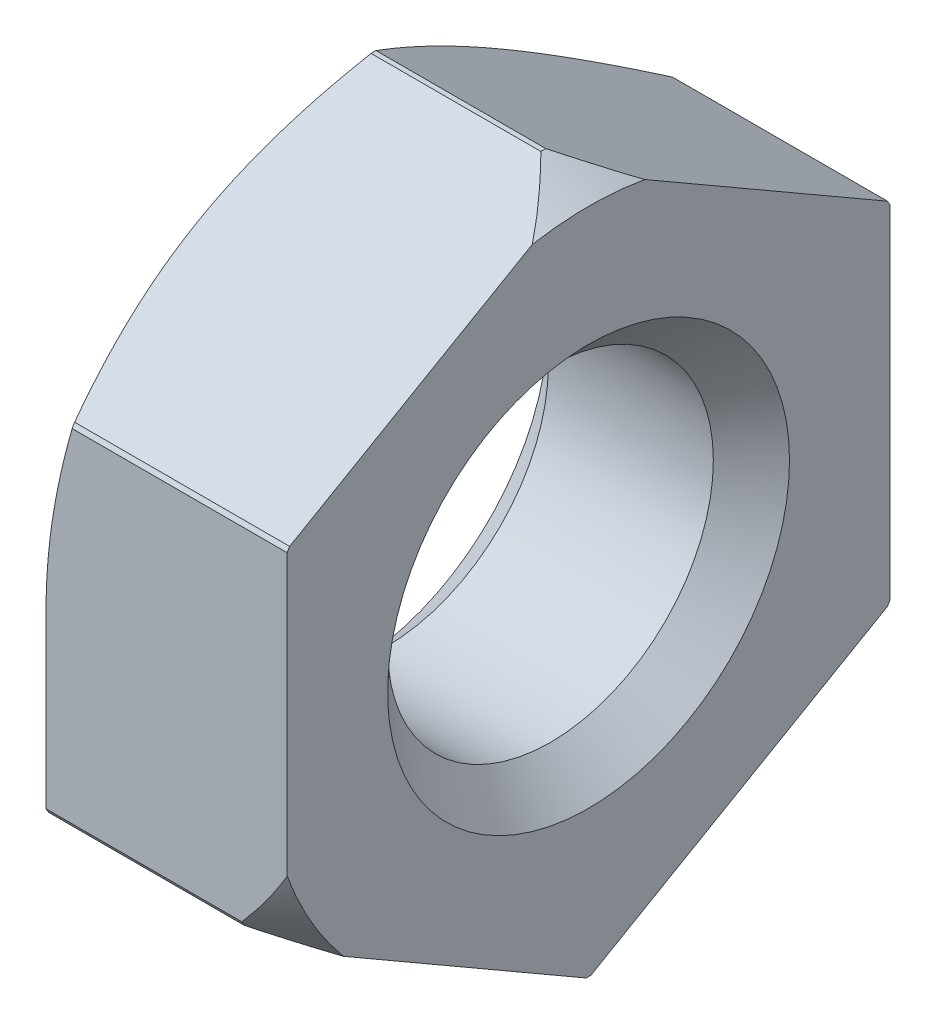
ISO-10303-21;
HEADER;
FILE_DESCRIPTION(('STEP AP214'),'2;1');
FILE_NAME('part.step','',(''),(''),'','','');
FILE_SCHEMA(('AUTOMOTIVE_DESIGN { 1 0 10303 214 1 1 1 1 }'));
ENDSEC;
DATA;
#1=APPLICATION_CONTEXT('core data for automotive mechanical design processes');
#2=APPLICATION_PROTOCOL_DEFINITION('international standard','automotive_design',2000,#1);
#3=PRODUCT_CONTEXT('',#1,'mechanical');
#4=PRODUCT('Part','Part','',(#3));
#5=PRODUCT_RELATED_PRODUCT_CATEGORY('part','',(#4));
#6=PRODUCT_DEFINITION_FORMATION('','',#4);
#7=PRODUCT_DEFINITION_CONTEXT('part definition',#1,'design');
#8=PRODUCT_DEFINITION('design','',#6,#7);
#9=PRODUCT_DEFINITION_SHAPE('','',#8);
#10=(LENGTH_UNIT() NAMED_UNIT(*) SI_UNIT(.MILLI.,.METRE.));
#11=(NAMED_UNIT(*) PLANE_ANGLE_UNIT() SI_UNIT($,.RADIAN.));
#12=(NAMED_UNIT(*) SI_UNIT($,.STERADIAN.) SOLID_ANGLE_UNIT());
#13=UNCERTAINTY_MEASURE_WITH_UNIT(LENGTH_MEASURE(1.E-05),#10,'distance_accuracy_value','');
#14=(GEOMETRIC_REPRESENTATION_CONTEXT(3) GLOBAL_UNCERTAINTY_ASSIGNED_CONTEXT((#13)) GLOBAL_UNIT_ASSIGNED_CONTEXT((#10,
#11,#12)) REPRESENTATION_CONTEXT('',''));
#15=CARTESIAN_POINT('',(0.,0.,0.));
#16=DIRECTION('',(0.,0.,1.));
#17=DIRECTION('',(1.,0.,0.));
#18=AXIS2_PLACEMENT_3D('',#15,#16,#17);
#19=CARTESIAN_POINT('',(2.4,0.,0.));
#20=DIRECTION('',(-1.,0.,0.));
#21=DIRECTION('',(0.,0.,1.));
#22=AXIS2_PLACEMENT_3D('',#19,#20,#21);
#23=CYLINDRICAL_SURFACE('',#22,3.45);
#24=DIRECTION('',(-1.,0.,0.));
#25=VECTOR('',#24,1.);
#26=CARTESIAN_POINT('',(2.4,1.74623995948333,2.97542366796791));
#27=LINE('',#26,#25);
#28=CARTESIAN_POINT('',(2.4,1.74623995948333,2.97542366796791));
#29=VERTEX_POINT('',#28);
#30=CARTESIAN_POINT('',(0.259807621135331,1.74623995948333,2.97542366796791));
#31=VERTEX_POINT('',#30);
#32=EDGE_CURVE('E164',#29,#31,#27,.T.);
#33=ORIENTED_EDGE('',*,*,#32,.T.);
#34=CARTESIAN_POINT('',(0.259807621135331,0.,0.));
#35=DIRECTION('',(-1.,0.,0.));
#36=DIRECTION('',(0.,0.,1.));
#37=AXIS2_PLACEMENT_3D('',#34,#35,#36);
#38=CIRCLE('',#37,3.45);
#39=CARTESIAN_POINT('',(0.259807621135331,1.70367250374008,3.));
#40=VERTEX_POINT('',#39);
#41=EDGE_CURVE('E484',#31,#40,#38,.F.);
#42=ORIENTED_EDGE('',*,*,#41,.T.);
#43=DIRECTION('',(-1.,0.,0.));
#44=VECTOR('',#43,1.);
#45=CARTESIAN_POINT('',(2.4,1.70367250374008,3.));
#46=LINE('',#45,#44);
#47=CARTESIAN_POINT('',(2.4,1.70367250374008,3.));
#48=VERTEX_POINT('',#47);
#49=EDGE_CURVE('E189',#48,#40,#46,.T.);
#50=ORIENTED_EDGE('',*,*,#49,.F.);
#51=CARTESIAN_POINT('',(2.4,0.,0.));
#52=DIRECTION('',(-1.,0.,0.));
#53=DIRECTION('',(0.,0.,1.));
#54=AXIS2_PLACEMENT_3D('',#51,#52,#53);
#55=CIRCLE('',#54,3.45);
#56=EDGE_CURVE('E181',#48,#29,#55,.T.);
#57=ORIENTED_EDGE('',*,*,#56,.T.);
#58=EDGE_LOOP('',(#33,#42,#50,#57));
#59=FACE_BOUND('',#58,.T.);
#60=ADVANCED_FACE('F43',(#59),#23,.T.);
#61=CARTESIAN_POINT('',(2.4,-1.70367250374008,3.));
#62=DIRECTION('',(0.,0.,1.));
#63=DIRECTION('',(1.,0.,0.));
#64=AXIS2_PLACEMENT_3D('',#61,#62,#63);
#65=PLANE('',#64);
#66=DIRECTION('',(-1.,0.,0.));
#67=VECTOR('',#66,1.);
#68=CARTESIAN_POINT('',(2.4,-1.70367250374008,3.));
#69=LINE('',#68,#67);
#70=CARTESIAN_POINT('',(1.95,-1.70367250374008,3.));
#71=VERTEX_POINT('',#70);
#72=CARTESIAN_POINT('',(0.,-1.70367250374008,3.));
#73=VERTEX_POINT('',#72);
#74=EDGE_CURVE('E223',#71,#73,#69,.T.);
#75=ORIENTED_EDGE('',*,*,#74,.F.);
#76=CARTESIAN_POINT('',(1.95,-1.70367250374008,3.));
#77=CARTESIAN_POINT('',(1.99150851419296,-1.65512741408454,3.));
#78=CARTESIAN_POINT('',(2.03226516747355,-1.6059226042952,3.));
#79=CARTESIAN_POINT('',(2.1118506468639,-1.50613259549134,3.));
#80=CARTESIAN_POINT('',(2.15068296537892,-1.45555017623143,3.));
#81=CARTESIAN_POINT('',(2.22616597035862,-1.35274693815643,3.));
#82=CARTESIAN_POINT('',(2.26281601541479,-1.30052564446719,3.));
#83=CARTESIAN_POINT('',(2.33350866310881,-1.19420919495531,3.));
#84=CARTESIAN_POINT('',(2.36754619936405,-1.14011067955635,3.));
#85=CARTESIAN_POINT('',(2.4,-1.08504719444189,3.));
#86=B_SPLINE_CURVE_WITH_KNOTS('',3,(#76,#77,#78,#79,#80,#81,#82,#83,#84,#85),.UNSPECIFIED.,.F.,
.F.,(4,2,2,2,4),(0.,0.191625259446611,0.38288895222914,0.574208586065673,0.765890329487178),.UNSPECIFIED.);
#87=CARTESIAN_POINT('',(2.4,-1.08504719444189,3.));
#88=VERTEX_POINT('',#87);
#89=EDGE_CURVE('E298',#71,#88,#86,.T.);
#90=ORIENTED_EDGE('',*,*,#89,.T.);
#91=DIRECTION('',(0.,1.,0.));
#92=VECTOR('',#91,1.);
#93=CARTESIAN_POINT('',(2.4,-1.70367250374008,3.));
#94=LINE('',#93,#92);
#95=EDGE_CURVE('E175',#88,#48,#94,.T.);
#96=ORIENTED_EDGE('',*,*,#95,.T.);
#97=ORIENTED_EDGE('',*,*,#49,.T.);
#98=CARTESIAN_POINT('',(0.259807621135331,1.70367250374008,3.));
#99=CARTESIAN_POINT('',(0.220236439414385,1.56492153802731,3.));
#100=CARTESIAN_POINT('',(0.18402382970066,1.42507692952094,3.));
#101=CARTESIAN_POINT('',(0.12021081323891,1.14417889643607,3.));
#102=CARTESIAN_POINT('',(0.0925687952321439,1.00313484065262,3.));
#103=CARTESIAN_POINT('',(0.0586537737699743,0.790276333626575,3.));
#104=CARTESIAN_POINT('',(0.0486028626338819,0.719063321652685,3.));
#105=CARTESIAN_POINT('',(0.0312096797144047,0.576306381173501,3.));
#106=CARTESIAN_POINT('',(0.023867343213695,0.504762460616135,3.));
#107=CARTESIAN_POINT('',(0.0120163936924285,0.361085348655588,3.));
#108=CARTESIAN_POINT('',(0.00752185262754016,0.288950987996894,3.));
#109=CARTESIAN_POINT('',(0.00150764654397767,0.144545521168622,3.));
#110=CARTESIAN_POINT('',(-1.14673782418395E-05,0.072274392148091,3.));
#111=CARTESIAN_POINT('',(0.,0.,3.));
#112=B_SPLINE_CURVE_WITH_KNOTS('',3,(#98,#99,#100,#101,#102,#103,#104,#105,#106,#107,#108,#109,
#110,#111),.UNSPECIFIED.,.F.,.F.,(4,2,2,2,2,2,4),(0.,0.43301708889585,0.86389765983147,
1.07960690564698,1.29531099708,1.5120728121694,1.72887477120121),.UNSPECIFIED.);
#113=CARTESIAN_POINT('',(0.,0.,3.));
#114=VERTEX_POINT('',#113);
#115=EDGE_CURVE('E306',#40,#114,#112,.T.);
#116=ORIENTED_EDGE('',*,*,#115,.T.);
#117=DIRECTION('',(0.,1.,0.));
#118=VECTOR('',#117,1.);
#119=CARTESIAN_POINT('',(0.,-1.70367250374008,3.));
#120=LINE('',#119,#118);
#121=EDGE_CURVE('E190',#73,#114,#120,.T.);
#122=ORIENTED_EDGE('',*,*,#121,.F.);
#123=EDGE_LOOP('',(#75,#90,#96,#97,#116,#122));
#124=FACE_BOUND('',#123,.T.);
#125=ADVANCED_FACE('F313',(#124),#65,.T.);
#126=CARTESIAN_POINT('',(2.4,0.,0.));
#127=DIRECTION('',(-1.,0.,0.));
#128=DIRECTION('',(0.,0.,1.));
#129=AXIS2_PLACEMENT_3D('',#126,#127,#128);
#130=CYLINDRICAL_SURFACE('',#129,3.45);
#131=DIRECTION('',(-1.,0.,0.));
#132=VECTOR('',#131,1.);
#133=CARTESIAN_POINT('',(2.4,-1.74623995948331,2.97542366796793));
#134=LINE('',#133,#132);
#135=CARTESIAN_POINT('',(1.95,-1.74623995948331,2.97542366796793));
#136=VERTEX_POINT('',#135);
#137=CARTESIAN_POINT('',(0.,-1.74623995948331,2.97542366796793));
#138=VERTEX_POINT('',#137);
#139=EDGE_CURVE('E225',#136,#138,#134,.T.);
#140=ORIENTED_EDGE('',*,*,#139,.F.);
#141=CARTESIAN_POINT('',(1.95,0.,0.));
#142=DIRECTION('',(-1.,0.,0.));
#143=DIRECTION('',(0.,0.,1.));
#144=AXIS2_PLACEMENT_3D('',#141,#142,#143);
#145=CIRCLE('',#144,3.45);
#146=EDGE_CURVE('E479',#136,#71,#145,.T.);
#147=ORIENTED_EDGE('',*,*,#146,.T.);
#148=ORIENTED_EDGE('',*,*,#74,.T.);
#149=CARTESIAN_POINT('',(0.,0.,0.));
#150=DIRECTION('',(-1.,0.,0.));
#151=DIRECTION('',(0.,0.,1.));
#152=AXIS2_PLACEMENT_3D('',#149,#150,#151);
#153=CIRCLE('',#152,3.45);
#154=EDGE_CURVE('E193',#138,#73,#153,.T.);
#155=ORIENTED_EDGE('',*,*,#154,.F.);
#156=EDGE_LOOP('',(#140,#147,#148,#155));
#157=FACE_BOUND('',#156,.T.);
#158=ADVANCED_FACE('F317',(#157),#130,.T.);
#159=CARTESIAN_POINT('',(2.4,-3.44991246322336,0.0245763320320992));
#160=DIRECTION('',(0.,-0.866025403784438,0.500000000000001));
#161=DIRECTION('',(0.,-0.500000000000001,-0.866025403784438));
#162=AXIS2_PLACEMENT_3D('',#159,#160,#161);
#163=PLANE('',#162);
#164=DIRECTION('',(0.,0.500000000000001,0.866025403784438));
#165=VECTOR('',#164,1.);
#166=CARTESIAN_POINT('',(0.,-3.44991246322336,0.0245763320320992));
#167=LINE('',#166,#165);
#168=CARTESIAN_POINT('',(0.,-2.59807621135333,1.50000000000001));
#169=VERTEX_POINT('',#168);
#170=EDGE_CURVE('E216',#169,#138,#167,.T.);
#171=ORIENTED_EDGE('',*,*,#170,.F.);
#172=CARTESIAN_POINT('',(0.,-2.59807621135331,1.5));
#173=CARTESIAN_POINT('',(-1.14673782346975E-05,-2.63421340742737,1.43740854035669));
#174=CARTESIAN_POINT('',(0.00150764654398873,-2.67034897193764,1.37481990666473));
#175=CARTESIAN_POINT('',(0.00752185262755396,-2.74255170535178,1.2497611039461));
#176=CARTESIAN_POINT('',(0.0120163936924412,-2.77861888568112,1.18729091512992));
#177=CARTESIAN_POINT('',(0.0238673432137061,-2.85045744166139,1.06286288622971));
#178=CARTESIAN_POINT('',(0.0312096797144154,-2.88622940194008,1.0009040335407));
#179=CARTESIAN_POINT('',(0.0486028626338918,-2.95760787217967,0.877272896519184));
#180=CARTESIAN_POINT('',(0.0586537737699839,-2.99321437816661,0.815600619069791));
#181=CARTESIAN_POINT('',(0.0925687952321519,-3.09964363167963,0.631259744573613));
#182=CARTESIAN_POINT('',(0.120210813238916,-3.17016565957136,0.509112009212356));
#183=CARTESIAN_POINT('',(0.184023829700664,-3.31061467611379,0.265847176687785));
#184=CARTESIAN_POINT('',(0.220236439414387,-3.38053698036697,0.144738193138982));
#185=CARTESIAN_POINT('',(0.259807621135331,-3.44991246322336,0.0245763320320985));
#186=B_SPLINE_CURVE_WITH_KNOTS('',3,(#172,#173,#174,#175,#176,#177,#178,#179,#180,#181,#182,
#183,#184,#185),.UNSPECIFIED.,.F.,.F.,(4,2,2,2,2,2,4),(0.,0.216801959031805,0.433563774121193,
0.649267865554209,0.864977111369718,1.29585768230533,1.72887477120117),.UNSPECIFIED.);
#187=CARTESIAN_POINT('',(0.259807621135331,-3.44991246322336,0.024576332032098));
#188=VERTEX_POINT('',#187);
#189=EDGE_CURVE('E269',#169,#188,#186,.T.);
#190=ORIENTED_EDGE('',*,*,#189,.T.);
#191=DIRECTION('',(-1.,0.,0.));
#192=VECTOR('',#191,1.);
#193=CARTESIAN_POINT('',(2.4,-3.44991246322336,0.024576332032098));
#194=LINE('',#193,#192);
#195=CARTESIAN_POINT('',(2.4,-3.44991246322336,0.024576332032098));
#196=VERTEX_POINT('',#195);
#197=EDGE_CURVE('E227',#196,#188,#194,.T.);
#198=ORIENTED_EDGE('',*,*,#197,.F.);
#199=DIRECTION('',(0.,0.500000000000001,0.866025403784438));
#200=VECTOR('',#199,1.);
#201=CARTESIAN_POINT('',(2.4,-3.44991246322336,0.0245763320320992));
#202=LINE('',#201,#200);
#203=CARTESIAN_POINT('',(2.4,-2.05555261413242,2.43967843469167));
#204=VERTEX_POINT('',#203);
#205=EDGE_CURVE('E212',#196,#204,#202,.T.);
#206=ORIENTED_EDGE('',*,*,#205,.T.);
#207=CARTESIAN_POINT('',(2.4,-2.05555261413242,2.43967843469167));
#208=CARTESIAN_POINT('',(2.36754619936405,-2.02802087157518,2.4873648116217));
#209=CARTESIAN_POINT('',(2.33350866310881,-2.0009716138757,2.53421550026423));
#210=CARTESIAN_POINT('',(2.26281601541479,-1.94781338911976,2.62628824638169));
#211=CARTESIAN_POINT('',(2.22616597035862,-1.92170274227514,2.67151321333505));
#212=CARTESIAN_POINT('',(2.15068296537893,-1.87030112323764,2.76054342909931));
#213=CARTESIAN_POINT('',(2.1118506468639,-1.84500991360768,2.80434908916327));
#214=CARTESIAN_POINT('',(2.03226516747355,-1.79511490920575,2.89076977183129));
#215=CARTESIAN_POINT('',(1.99150851419296,-1.77051250431108,2.93338238709724));
#216=CARTESIAN_POINT('',(1.95,-1.74623995948331,2.97542366796793));
#217=B_SPLINE_CURVE_WITH_KNOTS('',3,(#207,#208,#209,#210,#211,#212,#213,#214,#215,#216),
.UNSPECIFIED.,.F.,.F.,(4,2,2,2,4),(0.,0.191681743421509,0.383001377258046,0.574265070040579,
0.765890329487194),.UNSPECIFIED.);
#218=EDGE_CURVE('E261',#204,#136,#217,.T.);
#219=ORIENTED_EDGE('',*,*,#218,.T.);
#220=ORIENTED_EDGE('',*,*,#139,.T.);
#221=EDGE_LOOP('',(#171,#190,#198,#206,#219,#220));
#222=FACE_BOUND('',#221,.T.);
#223=ADVANCED_FACE('F276',(#222),#163,.T.);
#224=CARTESIAN_POINT('',(2.4,0.,0.));
#225=DIRECTION('',(-1.,0.,0.));
#226=DIRECTION('',(0.,0.,1.));
#227=AXIS2_PLACEMENT_3D('',#224,#225,#226);
#228=CYLINDRICAL_SURFACE('',#227,3.45);
#229=ORIENTED_EDGE('',*,*,#197,.T.);
#230=CARTESIAN_POINT('',(0.259807621135331,0.,0.));
#231=DIRECTION('',(-1.,0.,0.));
#232=DIRECTION('',(0.,0.,1.));
#233=AXIS2_PLACEMENT_3D('',#230,#231,#232);
#234=CIRCLE('',#233,3.45);
#235=CARTESIAN_POINT('',(0.259807621135331,-3.44991246322336,-0.0245763320321296));
#236=VERTEX_POINT('',#235);
#237=EDGE_CURVE('E451',#188,#236,#234,.F.);
#238=ORIENTED_EDGE('',*,*,#237,.T.);
#239=DIRECTION('',(-1.,0.,0.));
#240=VECTOR('',#239,1.);
#241=CARTESIAN_POINT('',(2.4,-3.44991246322336,-0.0245763320321296));
#242=LINE('',#241,#240);
#243=CARTESIAN_POINT('',(2.4,-3.44991246322336,-0.0245763320321296));
#244=VERTEX_POINT('',#243);
#245=EDGE_CURVE('E230',#244,#236,#242,.T.);
#246=ORIENTED_EDGE('',*,*,#245,.F.);
#247=CARTESIAN_POINT('',(2.4,0.,0.));
#248=DIRECTION('',(-1.,0.,0.));
#249=DIRECTION('',(0.,0.,1.));
#250=AXIS2_PLACEMENT_3D('',#247,#248,#249);
#251=CIRCLE('',#250,3.45);
#252=EDGE_CURVE('E209',#244,#196,#251,.T.);
#253=ORIENTED_EDGE('',*,*,#252,.T.);
#254=EDGE_LOOP('',(#229,#238,#246,#253));
#255=FACE_BOUND('',#254,.T.);
#256=ADVANCED_FACE('F327',(#255),#228,.T.);
#257=CARTESIAN_POINT('',(2.4,-1.74623995948334,-2.97542366796791));
#258=DIRECTION('',(0.,-0.866025403784438,-0.500000000000001));
#259=DIRECTION('',(0.,0.500000000000001,-0.866025403784438));
#260=AXIS2_PLACEMENT_3D('',#257,#258,#259);
#261=PLANE('',#260);
#262=ORIENTED_EDGE('',*,*,#245,.T.);
#263=CARTESIAN_POINT('',(0.259807621135331,-3.44991246322336,-0.0245763320321296));
#264=CARTESIAN_POINT('',(0.220236439414388,-3.38053698036697,-0.144738193139012));
#265=CARTESIAN_POINT('',(0.184023829700666,-3.31061467611379,-0.265847176687813));
#266=CARTESIAN_POINT('',(0.12021081323892,-3.17016565957136,-0.509112009212381));
#267=CARTESIAN_POINT('',(0.0925687952321568,-3.09964363167964,-0.631259744573636));
#268=CARTESIAN_POINT('',(0.05865377376999,-2.99321437816662,-0.815600619069812));
#269=CARTESIAN_POINT('',(0.0486028626338984,-2.95760787217967,-0.877272896519204));
#270=CARTESIAN_POINT('',(0.0312096797144228,-2.88622940194008,-1.00090403354072));
#271=CARTESIAN_POINT('',(0.023867343213714,-2.8504574416614,-1.06286288622973));
#272=CARTESIAN_POINT('',(0.0120163936924487,-2.77861888568113,-1.18729091512994));
#273=CARTESIAN_POINT('',(0.00752185262756063,-2.74255170535178,-1.24976110394611));
#274=CARTESIAN_POINT('',(0.00150764654399861,-2.67034897193765,-1.37481990666474));
#275=CARTESIAN_POINT('',(-1.14673782207357E-05,-2.63421340742739,-1.4374085403567));
#276=CARTESIAN_POINT('',(0.,-2.59807621135334,-1.50000000000003));
#277=B_SPLINE_CURVE_WITH_KNOTS('',3,(#263,#264,#265,#266,#267,#268,#269,#270,#271,#272,#273,
#274,#275,#276),.UNSPECIFIED.,.F.,.F.,(4,2,2,2,2,2,4),(0.,0.433017088895835,0.863897659831439,
1.07960690564694,1.29531099707996,1.51207281216934,1.72887477120115),.UNSPECIFIED.);
#278=CARTESIAN_POINT('',(0.,-2.59807621135335,-1.50000000000002));
#279=VERTEX_POINT('',#278);
#280=EDGE_CURVE('E450',#236,#279,#277,.T.);
#281=ORIENTED_EDGE('',*,*,#280,.T.);
#282=CARTESIAN_POINT('',(0.,-2.59807621135331,-1.5));
#283=CARTESIAN_POINT('',(-1.14673782293608E-05,-2.56193901527929,-1.56259145964334));
#284=CARTESIAN_POINT('',(0.00150764654399602,-2.52580345076903,-1.6251800933353));
#285=CARTESIAN_POINT('',(0.00752185262756231,-2.45360071735491,-1.75023889605394));
#286=CARTESIAN_POINT('',(0.0120163936924486,-2.41753353702556,-1.81270908487011));
#287=CARTESIAN_POINT('',(0.0238673432137128,-2.34569498104529,-1.93713711377032));
#288=CARTESIAN_POINT('',(0.0312096797144223,-2.30992302076661,-1.99909596645933));
#289=CARTESIAN_POINT('',(0.0486028626338983,-2.23854455052702,-2.12272710348084));
#290=CARTESIAN_POINT('',(0.0586537737699898,-2.20293804454007,-2.18439938093023));
#291=CARTESIAN_POINT('',(0.0925687952321564,-2.09650879102705,-2.36874025542641));
#292=CARTESIAN_POINT('',(0.12021081323892,-2.02598676313533,-2.49088799078766));
#293=CARTESIAN_POINT('',(0.184023829700666,-1.8855377465929,-2.73415282331223));
#294=CARTESIAN_POINT('',(0.220236439414388,-1.81561544233972,-2.85526180686103));
#295=CARTESIAN_POINT('',(0.259807621135331,-1.74623995948334,-2.97542366796791));
#296=B_SPLINE_CURVE_WITH_KNOTS('',3,(#282,#283,#284,#285,#286,#287,#288,#289,#290,#291,#292,
#293,#294,#295),.UNSPECIFIED.,.F.,.F.,(4,2,2,2,2,2,4),(0.,0.216801959031801,0.433563774121185,
0.649267865554198,0.864977111369703,1.29585768230531,1.72887477120114),.UNSPECIFIED.);
#297=CARTESIAN_POINT('',(0.259807621135331,-1.74623995948333,-2.97542366796791));
#298=VERTEX_POINT('',#297);
#299=EDGE_CURVE('E444',#279,#298,#296,.T.);
#300=ORIENTED_EDGE('',*,*,#299,.T.);
#301=DIRECTION('',(-1.,0.,0.));
#302=VECTOR('',#301,1.);
#303=CARTESIAN_POINT('',(2.4,-1.74623995948333,-2.97542366796791));
#304=LINE('',#303,#302);
#305=CARTESIAN_POINT('',(2.4,-1.74623995948333,-2.97542366796791));
#306=VERTEX_POINT('',#305);
#307=EDGE_CURVE('E233',#306,#298,#304,.T.);
#308=ORIENTED_EDGE('',*,*,#307,.F.);
#309=DIRECTION('',(0.,-0.500000000000001,0.866025403784438));
#310=VECTOR('',#309,1.);
#311=CARTESIAN_POINT('',(2.4,-1.74623995948334,-2.97542366796791));
#312=LINE('',#311,#310);
#313=EDGE_CURVE('E206',#306,#244,#312,.T.);
#314=ORIENTED_EDGE('',*,*,#313,.T.);
#315=EDGE_LOOP('',(#262,#281,#300,#308,#314));
#316=FACE_BOUND('',#315,.T.);
#317=ADVANCED_FACE('F456',(#316),#261,.T.);
#318=CARTESIAN_POINT('',(2.4,0.,0.));
#319=DIRECTION('',(-1.,0.,0.));
#320=DIRECTION('',(0.,0.,1.));
#321=AXIS2_PLACEMENT_3D('',#318,#319,#320);
#322=CYLINDRICAL_SURFACE('',#321,3.45);
#323=ORIENTED_EDGE('',*,*,#307,.T.);
#324=CARTESIAN_POINT('',(0.259807621135331,0.,0.));
#325=DIRECTION('',(-1.,0.,0.));
#326=DIRECTION('',(0.,0.,1.));
#327=AXIS2_PLACEMENT_3D('',#324,#325,#326);
#328=CIRCLE('',#327,3.45);
#329=CARTESIAN_POINT('',(0.259807621135331,-1.70367250374008,-3.));
#330=VERTEX_POINT('',#329);
#331=EDGE_CURVE('E59',#298,#330,#328,.F.);
#332=ORIENTED_EDGE('',*,*,#331,.T.);
#333=DIRECTION('',(-1.,0.,0.));
#334=VECTOR('',#333,1.);
#335=CARTESIAN_POINT('',(2.4,-1.70367250374008,-3.));
#336=LINE('',#335,#334);
#337=CARTESIAN_POINT('',(2.4,-1.70367250374008,-3.));
#338=VERTEX_POINT('',#337);
#339=EDGE_CURVE('E235',#338,#330,#336,.T.);
#340=ORIENTED_EDGE('',*,*,#339,.F.);
#341=CARTESIAN_POINT('',(2.4,0.,0.));
#342=DIRECTION('',(-1.,0.,0.));
#343=DIRECTION('',(0.,0.,1.));
#344=AXIS2_PLACEMENT_3D('',#341,#342,#343);
#345=CIRCLE('',#344,3.45);
#346=EDGE_CURVE('E203',#338,#306,#345,.T.);
#347=ORIENTED_EDGE('',*,*,#346,.T.);
#348=EDGE_LOOP('',(#323,#332,#340,#347));
#349=FACE_BOUND('',#348,.T.);
#350=ADVANCED_FACE('F406',(#349),#322,.T.);
#351=CARTESIAN_POINT('',(2.4,1.70367250374008,-3.));
#352=DIRECTION('',(0.,0.,-1.));
#353=DIRECTION('',(-1.,0.,0.));
#354=AXIS2_PLACEMENT_3D('',#351,#352,#353);
#355=PLANE('',#354);
#356=CARTESIAN_POINT('',(0.259807621135331,-1.70367250374008,-3.));
#357=CARTESIAN_POINT('',(0.220236439414385,-1.56492153802731,-3.));
#358=CARTESIAN_POINT('',(0.18402382970066,-1.42507692952094,-3.));
#359=CARTESIAN_POINT('',(0.120210813238909,-1.14417889643607,-3.));
#360=CARTESIAN_POINT('',(0.0925687952321435,-1.00313484065262,-3.));
#361=CARTESIAN_POINT('',(0.0586537737699739,-0.790276333626575,-3.));
#362=CARTESIAN_POINT('',(0.0486028626338814,-0.719063321652685,-3.));
#363=CARTESIAN_POINT('',(0.0312096797144043,-0.576306381173501,-3.));
#364=CARTESIAN_POINT('',(0.0238673432136948,-0.504762460616135,-3.));
#365=CARTESIAN_POINT('',(0.0120163936924283,-0.361085348655589,-3.));
#366=CARTESIAN_POINT('',(0.00752185262753977,-0.288950987996894,-3.));
#367=CARTESIAN_POINT('',(0.00150764654397706,-0.144545521168622,-3.));
#368=CARTESIAN_POINT('',(-1.14673782425228E-05,-0.0722743921480914,-3.));
#369=CARTESIAN_POINT('',(0.,0.,-3.));
#370=B_SPLINE_CURVE_WITH_KNOTS('',3,(#356,#357,#358,#359,#360,#361,#362,#363,#364,#365,#366,
#367,#368,#369),.UNSPECIFIED.,.F.,.F.,(4,2,2,2,2,2,4),(0.,0.43301708889585,0.863897659831469,
1.07960690564698,1.29531099708,1.5120728121694,1.72887477120121),.UNSPECIFIED.);
#371=CARTESIAN_POINT('',(0.,0.,-3.));
#372=VERTEX_POINT('',#371);
#373=EDGE_CURVE('E410',#330,#372,#370,.T.);
#374=ORIENTED_EDGE('',*,*,#373,.T.);
#375=CARTESIAN_POINT('',(0.,0.,-3.));
#376=CARTESIAN_POINT('',(-1.1467378242675E-05,0.0722743921480918,-3.));
#377=CARTESIAN_POINT('',(0.00150764654397756,0.144545521168623,-3.));
#378=CARTESIAN_POINT('',(0.00752185262754076,0.288950987996894,-3.));
#379=CARTESIAN_POINT('',(0.0120163936924291,0.361085348655589,-3.));
#380=CARTESIAN_POINT('',(0.0238673432136954,0.504762460616135,-3.));
#381=CARTESIAN_POINT('',(0.031209679714405,0.576306381173502,-3.));
#382=CARTESIAN_POINT('',(0.0486028626338821,0.719063321652685,-3.));
#383=CARTESIAN_POINT('',(0.0586537737699746,0.790276333626576,-3.));
#384=CARTESIAN_POINT('',(0.0925687952321442,1.00313484065262,-3.));
#385=CARTESIAN_POINT('',(0.12021081323891,1.14417889643607,-3.));
#386=CARTESIAN_POINT('',(0.184023829700661,1.42507692952094,-3.));
#387=CARTESIAN_POINT('',(0.220236439414385,1.56492153802731,-3.));
#388=CARTESIAN_POINT('',(0.259807621135331,1.70367250374008,-3.));
#389=B_SPLINE_CURVE_WITH_KNOTS('',3,(#375,#376,#377,#378,#379,#380,#381,#382,#383,#384,#385,
#386,#387,#388),.UNSPECIFIED.,.F.,.F.,(4,2,2,2,2,2,4),(0.,0.216801959031811,0.433563774121204,
0.649267865554225,0.864977111369738,1.29585768230536,1.72887477120121),.UNSPECIFIED.);
#390=CARTESIAN_POINT('',(0.259807621135331,1.70367250374008,-3.));
#391=VERTEX_POINT('',#390);
#392=EDGE_CURVE('E67',#372,#391,#389,.T.);
#393=ORIENTED_EDGE('',*,*,#392,.T.);
#394=DIRECTION('',(-1.,0.,0.));
#395=VECTOR('',#394,1.);
#396=CARTESIAN_POINT('',(2.4,1.70367250374008,-3.));
#397=LINE('',#396,#395);
#398=CARTESIAN_POINT('',(2.4,1.70367250374008,-3.));
#399=VERTEX_POINT('',#398);
#400=EDGE_CURVE('E237',#399,#391,#397,.T.);
#401=ORIENTED_EDGE('',*,*,#400,.F.);
#402=DIRECTION('',(0.,-1.,0.));
#403=VECTOR('',#402,1.);
#404=CARTESIAN_POINT('',(2.4,1.70367250374008,-3.));
#405=LINE('',#404,#403);
#406=EDGE_CURVE('E200',#399,#338,#405,.T.);
#407=ORIENTED_EDGE('',*,*,#406,.T.);
#408=ORIENTED_EDGE('',*,*,#339,.T.);
#409=EDGE_LOOP('',(#374,#393,#401,#407,#408));
#410=FACE_BOUND('',#409,.T.);
#411=ADVANCED_FACE('F401',(#410),#355,.T.);
#412=CARTESIAN_POINT('',(2.4,0.,0.));
#413=DIRECTION('',(-1.,0.,0.));
#414=DIRECTION('',(0.,0.,1.));
#415=AXIS2_PLACEMENT_3D('',#412,#413,#414);
#416=CYLINDRICAL_SURFACE('',#415,3.45);
#417=ORIENTED_EDGE('',*,*,#400,.T.);
#418=CARTESIAN_POINT('',(0.259807621135331,0.,0.));
#419=DIRECTION('',(-1.,0.,0.));
#420=DIRECTION('',(0.,0.,1.));
#421=AXIS2_PLACEMENT_3D('',#418,#419,#420);
#422=CIRCLE('',#421,3.45);
#423=CARTESIAN_POINT('',(0.259807621135331,1.74623995948331,-2.97542366796793));
#424=VERTEX_POINT('',#423);
#425=EDGE_CURVE('E423',#391,#424,#422,.F.);
#426=ORIENTED_EDGE('',*,*,#425,.T.);
#427=DIRECTION('',(-1.,0.,0.));
#428=VECTOR('',#427,1.);
#429=CARTESIAN_POINT('',(2.4,1.74623995948331,-2.97542366796793));
#430=LINE('',#429,#428);
#431=CARTESIAN_POINT('',(2.4,1.74623995948331,-2.97542366796793));
#432=VERTEX_POINT('',#431);
#433=EDGE_CURVE('E239',#432,#424,#430,.T.);
#434=ORIENTED_EDGE('',*,*,#433,.F.);
#435=CARTESIAN_POINT('',(2.4,0.,0.));
#436=DIRECTION('',(-1.,0.,0.));
#437=DIRECTION('',(0.,0.,1.));
#438=AXIS2_PLACEMENT_3D('',#435,#436,#437);
#439=CIRCLE('',#438,3.45);
#440=EDGE_CURVE('E197',#432,#399,#439,.T.);
#441=ORIENTED_EDGE('',*,*,#440,.T.);
#442=EDGE_LOOP('',(#417,#426,#434,#441));
#443=FACE_BOUND('',#442,.T.);
#444=ADVANCED_FACE('F395',(#443),#416,.T.);
#445=CARTESIAN_POINT('',(2.4,3.44991246322336,-0.0245763320320992));
#446=DIRECTION('',(0.,0.866025403784438,-0.500000000000001));
#447=DIRECTION('',(0.,0.500000000000001,0.866025403784438));
#448=AXIS2_PLACEMENT_3D('',#445,#446,#447);
#449=PLANE('',#448);
#450=DIRECTION('',(-1.,0.,0.));
#451=VECTOR('',#450,1.);
#452=CARTESIAN_POINT('',(2.4,3.44991246322336,-0.0245763320320992));
#453=LINE('',#452,#451);
#454=CARTESIAN_POINT('',(1.94999999999999,3.44991246322336,-0.0245763320320992));
#455=VERTEX_POINT('',#454);
#456=CARTESIAN_POINT('',(0.259807621135331,3.44991246322336,-0.0245763320320992));
#457=VERTEX_POINT('',#456);
#458=EDGE_CURVE('E242',#455,#457,#453,.T.);
#459=ORIENTED_EDGE('',*,*,#458,.F.);
#460=CARTESIAN_POINT('',(1.94999999999999,3.44991246322336,-0.0245763320320992));
#461=CARTESIAN_POINT('',(1.99150851419296,3.42563991839558,-0.0666176129027946));
#462=CARTESIAN_POINT('',(2.03226516747355,3.40103751350092,-0.109230228168741));
#463=CARTESIAN_POINT('',(2.1118506468639,3.35114250909898,-0.195650910836761));
#464=CARTESIAN_POINT('',(2.15068296537893,3.32585129946903,-0.239456570900723));
#465=CARTESIAN_POINT('',(2.22616597035862,3.27444968043152,-0.328486786664977));
#466=CARTESIAN_POINT('',(2.26281601541479,3.2483390335869,-0.373711753618345));
#467=CARTESIAN_POINT('',(2.33350866310881,3.19518080883096,-0.465784499735804));
#468=CARTESIAN_POINT('',(2.36754619936405,3.16813155113148,-0.512635188378327));
#469=CARTESIAN_POINT('',(2.4,3.14059980857425,-0.560321565308364));
#470=B_SPLINE_CURVE_WITH_KNOTS('',3,(#460,#461,#462,#463,#464,#465,#466,#467,#468,#469),
.UNSPECIFIED.,.F.,.F.,(4,2,2,2,4),(0.,0.191625259446616,0.382888952229149,0.574208586065687,
0.765890329487197),.UNSPECIFIED.);
#471=CARTESIAN_POINT('',(2.4,3.14059980857425,-0.560321565308364));
#472=VERTEX_POINT('',#471);
#473=EDGE_CURVE('E380',#455,#472,#470,.T.);
#474=ORIENTED_EDGE('',*,*,#473,.T.);
#475=DIRECTION('',(0.,-0.500000000000001,-0.866025403784438));
#476=VECTOR('',#475,1.);
#477=CARTESIAN_POINT('',(2.4,3.44991246322336,-0.0245763320320992));
#478=LINE('',#477,#476);
#479=EDGE_CURVE('E185',#472,#432,#478,.T.);
#480=ORIENTED_EDGE('',*,*,#479,.T.);
#481=ORIENTED_EDGE('',*,*,#433,.T.);
#482=CARTESIAN_POINT('',(0.259807621135331,1.74623995948331,-2.97542366796793));
#483=CARTESIAN_POINT('',(0.220236439414387,1.8156154423397,-2.85526180686105));
#484=CARTESIAN_POINT('',(0.184023829700664,1.88553774659288,-2.73415282331224));
#485=CARTESIAN_POINT('',(0.120210813238916,2.02598676313531,-2.49088799078767));
#486=CARTESIAN_POINT('',(0.0925687952321516,2.09650879102703,-2.36874025542642));
#487=CARTESIAN_POINT('',(0.0586537737699838,2.20293804454005,-2.18439938093024));
#488=CARTESIAN_POINT('',(0.0486028626338919,2.238544550527,-2.12272710348084));
#489=CARTESIAN_POINT('',(0.0312096797144157,2.30992302076659,-1.99909596645933));
#490=CARTESIAN_POINT('',(0.0238673432137064,2.34569498104527,-1.93713711377032));
#491=CARTESIAN_POINT('',(0.0120163936924405,2.41753353702554,-1.8127090848701));
#492=CARTESIAN_POINT('',(0.00752185262755234,2.45360071735489,-1.75023889605393));
#493=CARTESIAN_POINT('',(0.00150764654399015,2.52580345076903,-1.6251800933353));
#494=CARTESIAN_POINT('',(-1.14673782292335E-05,2.56193901527929,-1.56259145964334));
#495=CARTESIAN_POINT('',(0.,2.59807621135334,-1.50000000000001));
#496=B_SPLINE_CURVE_WITH_KNOTS('',3,(#482,#483,#484,#485,#486,#487,#488,#489,#490,#491,#492,
#493,#494,#495),.UNSPECIFIED.,.F.,.F.,(4,2,2,2,2,2,4),(0.,0.433017088895841,0.863897659831451,
1.07960690564696,1.29531099707998,1.51207281216937,1.72887477120117),.UNSPECIFIED.);
#497=CARTESIAN_POINT('',(0.,2.59807621135333,-1.50000000000001));
#498=VERTEX_POINT('',#497);
#499=EDGE_CURVE('E381',#424,#498,#496,.T.);
#500=ORIENTED_EDGE('',*,*,#499,.T.);
#501=CARTESIAN_POINT('',(0.,2.59807621135331,-1.5));
#502=CARTESIAN_POINT('',(-1.14673782345952E-05,2.63421340742737,-1.43740854035669));
#503=CARTESIAN_POINT('',(0.00150764654398885,2.67034897193764,-1.37481990666473));
#504=CARTESIAN_POINT('',(0.00752185262755408,2.74255170535178,-1.2497611039461));
#505=CARTESIAN_POINT('',(0.0120163936924413,2.77861888568112,-1.18729091512992));
#506=CARTESIAN_POINT('',(0.0238673432137063,2.85045744166139,-1.06286288622971));
#507=CARTESIAN_POINT('',(0.0312096797144157,2.88622940194008,-1.0009040335407));
#508=CARTESIAN_POINT('',(0.0486028626338919,2.95760787217967,-0.877272896519184));
#509=CARTESIAN_POINT('',(0.0586537737699837,2.99321437816661,-0.815600619069791));
#510=CARTESIAN_POINT('',(0.0925687952321514,3.09964363167963,-0.631259744573613));
#511=CARTESIAN_POINT('',(0.120210813238916,3.17016565957136,-0.509112009212357));
#512=CARTESIAN_POINT('',(0.184023829700664,3.31061467611379,-0.265847176687786));
#513=CARTESIAN_POINT('',(0.220236439414387,3.38053698036697,-0.144738193138984));
#514=CARTESIAN_POINT('',(0.259807621135331,3.44991246322336,-0.0245763320320998));
#515=B_SPLINE_CURVE_WITH_KNOTS('',3,(#501,#502,#503,#504,#505,#506,#507,#508,#509,#510,#511,
#512,#513,#514),.UNSPECIFIED.,.F.,.F.,(4,2,2,2,2,2,4),(0.,0.216801959031805,0.433563774121193,
0.649267865554209,0.864977111369717,1.29585768230533,1.72887477120117),.UNSPECIFIED.);
#516=EDGE_CURVE('E373',#498,#457,#515,.T.);
#517=ORIENTED_EDGE('',*,*,#516,.T.);
#518=EDGE_LOOP('',(#459,#474,#480,#481,#500,#517));
#519=FACE_BOUND('',#518,.T.);
#520=ADVANCED_FACE('F391',(#519),#449,.T.);
#521=CARTESIAN_POINT('',(2.4,0.,0.));
#522=DIRECTION('',(-1.,0.,0.));
#523=DIRECTION('',(0.,0.,1.));
#524=AXIS2_PLACEMENT_3D('',#521,#522,#523);
#525=CYLINDRICAL_SURFACE('',#524,3.45);
#526=ORIENTED_EDGE('',*,*,#458,.T.);
#527=CARTESIAN_POINT('',(0.259807621135331,0.,0.));
#528=DIRECTION('',(-1.,0.,0.));
#529=DIRECTION('',(0.,0.,1.));
#530=AXIS2_PLACEMENT_3D('',#527,#528,#529);
#531=CIRCLE('',#530,3.45);
#532=CARTESIAN_POINT('',(0.259807621135331,3.44991246322336,0.0245763320321296));
#533=VERTEX_POINT('',#532);
#534=EDGE_CURVE('E488',#457,#533,#531,.F.);
#535=ORIENTED_EDGE('',*,*,#534,.T.);
#536=DIRECTION('',(-1.,0.,0.));
#537=VECTOR('',#536,1.);
#538=CARTESIAN_POINT('',(2.4,3.44991246322336,0.0245763320321296));
#539=LINE('',#538,#537);
#540=CARTESIAN_POINT('',(1.94999999999999,3.44991246322336,0.0245763320321296));
#541=VERTEX_POINT('',#540);
#542=EDGE_CURVE('E174',#541,#533,#539,.T.);
#543=ORIENTED_EDGE('',*,*,#542,.F.);
#544=CARTESIAN_POINT('',(1.94999999999999,0.,0.));
#545=DIRECTION('',(-1.,0.,0.));
#546=DIRECTION('',(0.,0.,1.));
#547=AXIS2_PLACEMENT_3D('',#544,#545,#546);
#548=CIRCLE('',#547,3.45);
#549=EDGE_CURVE('E495',#541,#455,#548,.T.);
#550=ORIENTED_EDGE('',*,*,#549,.T.);
#551=EDGE_LOOP('',(#526,#535,#543,#550));
#552=FACE_BOUND('',#551,.T.);
#553=ADVANCED_FACE('F337',(#552),#525,.T.);
#554=CARTESIAN_POINT('',(2.4,1.74623995948333,2.97542366796791));
#555=DIRECTION('',(0.,0.866025403784438,0.500000000000001));
#556=DIRECTION('',(0.,-0.500000000000001,0.866025403784438));
#557=AXIS2_PLACEMENT_3D('',#554,#555,#556);
#558=PLANE('',#557);
#559=CARTESIAN_POINT('',(0.259807621135331,3.44991246322336,0.0245763320321296));
#560=CARTESIAN_POINT('',(0.220236439414388,3.38053698036697,0.144738193139012));
#561=CARTESIAN_POINT('',(0.184023829700666,3.31061467611379,0.265847176687813));
#562=CARTESIAN_POINT('',(0.12021081323892,3.17016565957136,0.509112009212381));
#563=CARTESIAN_POINT('',(0.092568795232157,3.09964363167964,0.631259744573636));
#564=CARTESIAN_POINT('',(0.0586537737699902,2.99321437816662,0.815600619069812));
#565=CARTESIAN_POINT('',(0.0486028626338985,2.95760787217967,0.877272896519204));
#566=CARTESIAN_POINT('',(0.0312096797144229,2.88622940194008,1.00090403354072));
#567=CARTESIAN_POINT('',(0.0238673432137141,2.8504574416614,1.06286288622973));
#568=CARTESIAN_POINT('',(0.0120163936924488,2.77861888568113,1.18729091512994));
#569=CARTESIAN_POINT('',(0.00752185262756071,2.74255170535179,1.24976110394611));
#570=CARTESIAN_POINT('',(0.00150764654399867,2.67034897193765,1.37481990666474));
#571=CARTESIAN_POINT('',(-1.14673782206714E-05,2.63421340742739,1.4374085403567));
#572=CARTESIAN_POINT('',(0.,2.59807621135334,1.50000000000003));
#573=B_SPLINE_CURVE_WITH_KNOTS('',3,(#559,#560,#561,#562,#563,#564,#565,#566,#567,#568,#569,
#570,#571,#572),.UNSPECIFIED.,.F.,.F.,(4,2,2,2,2,2,4),(0.,0.433017088895835,0.863897659831438,
1.07960690564694,1.29531099707996,1.51207281216934,1.72887477120115),.UNSPECIFIED.);
#574=CARTESIAN_POINT('',(0.,2.59807621135335,1.50000000000002));
#575=VERTEX_POINT('',#574);
#576=EDGE_CURVE('E350',#533,#575,#573,.T.);
#577=ORIENTED_EDGE('',*,*,#576,.T.);
#578=CARTESIAN_POINT('',(0.,2.59807621135331,1.5));
#579=CARTESIAN_POINT('',(-1.14673782293217E-05,2.56193901527929,1.56259145964334));
#580=CARTESIAN_POINT('',(0.00150764654399621,2.52580345076903,1.6251800933353));
#581=CARTESIAN_POINT('',(0.00752185262756275,2.45360071735491,1.75023889605394));
#582=CARTESIAN_POINT('',(0.0120163936924492,2.41753353702556,1.81270908487011));
#583=CARTESIAN_POINT('',(0.0238673432137133,2.34569498104529,1.93713711377032));
#584=CARTESIAN_POINT('',(0.0312096797144226,2.30992302076661,1.99909596645933));
#585=CARTESIAN_POINT('',(0.0486028626338985,2.23854455052702,2.12272710348084));
#586=CARTESIAN_POINT('',(0.0586537737699901,2.20293804454007,2.18439938093023));
#587=CARTESIAN_POINT('',(0.0925687952321567,2.09650879102705,2.36874025542641));
#588=CARTESIAN_POINT('',(0.12021081323892,2.02598676313533,2.49088799078766));
#589=CARTESIAN_POINT('',(0.184023829700666,1.8855377465929,2.73415282331223));
#590=CARTESIAN_POINT('',(0.220236439414387,1.81561544233972,2.85526180686103));
#591=CARTESIAN_POINT('',(0.259807621135331,1.74623995948333,2.97542366796791));
#592=B_SPLINE_CURVE_WITH_KNOTS('',3,(#578,#579,#580,#581,#582,#583,#584,#585,#586,#587,#588,
#589,#590,#591),.UNSPECIFIED.,.F.,.F.,(4,2,2,2,2,2,4),(0.,0.216801959031801,0.433563774121185,
0.649267865554198,0.864977111369703,1.29585768230531,1.72887477120114),.UNSPECIFIED.);
#593=EDGE_CURVE('E170',#575,#31,#592,.T.);
#594=ORIENTED_EDGE('',*,*,#593,.T.);
#595=ORIENTED_EDGE('',*,*,#32,.F.);
#596=DIRECTION('',(0.,0.500000000000001,-0.866025403784438));
#597=VECTOR('',#596,1.);
#598=CARTESIAN_POINT('',(2.4,1.74623995948333,2.97542366796791));
#599=LINE('',#598,#597);
#600=CARTESIAN_POINT('',(2.4,3.14059980857424,0.560321565308408));
#601=VERTEX_POINT('',#600);
#602=EDGE_CURVE('E168',#29,#601,#599,.T.);
#603=ORIENTED_EDGE('',*,*,#602,.T.);
#604=CARTESIAN_POINT('',(2.4,3.14059980857424,0.560321565308408));
#605=CARTESIAN_POINT('',(2.36754619936405,3.16813155113147,0.512635188378369));
#606=CARTESIAN_POINT('',(2.33350866310881,3.19518080883095,0.465784499735845));
#607=CARTESIAN_POINT('',(2.26281601541479,3.2483390335869,0.373711753618384));
#608=CARTESIAN_POINT('',(2.22616597035862,3.27444968043152,0.328486786665016));
#609=CARTESIAN_POINT('',(2.15068296537893,3.32585129946902,0.239456570900759));
#610=CARTESIAN_POINT('',(2.1118506468639,3.35114250909898,0.195650910836796));
#611=CARTESIAN_POINT('',(2.03226516747355,3.40103751350091,0.109230228168774));
#612=CARTESIAN_POINT('',(1.99150851419296,3.42563991839558,0.0666176129028261));
#613=CARTESIAN_POINT('',(1.94999999999999,3.44991246322336,0.0245763320321298));
#614=B_SPLINE_CURVE_WITH_KNOTS('',3,(#604,#605,#606,#607,#608,#609,#610,#611,#612,#613),
.UNSPECIFIED.,.F.,.F.,(4,2,2,2,4),(0.,0.191681743421513,0.383001377258054,0.574265070040591,
0.765890329487211),.UNSPECIFIED.);
#615=EDGE_CURVE('E342',#601,#541,#614,.T.);
#616=ORIENTED_EDGE('',*,*,#615,.T.);
#617=ORIENTED_EDGE('',*,*,#542,.T.);
#618=EDGE_LOOP('',(#577,#594,#595,#603,#616,#617));
#619=FACE_BOUND('',#618,.T.);
#620=ADVANCED_FACE('F167',(#619),#558,.T.);
#621=CARTESIAN_POINT('',(2.4,0.,0.));
#622=DIRECTION('',(-1.,0.,0.));
#623=DIRECTION('',(0.,0.,1.));
#624=AXIS2_PLACEMENT_3D('',#621,#622,#623);
#625=PLANE('',#624);
#626=CARTESIAN_POINT('',(2.4,0.,0.));
#627=DIRECTION('',(-1.,0.,0.));
#628=DIRECTION('',(0.,0.,1.));
#629=AXIS2_PLACEMENT_3D('',#626,#627,#628);
#630=CIRCLE('',#629,1.99999999999999);
#631=CARTESIAN_POINT('',(2.4,0.,-1.99999999999999));
#632=VERTEX_POINT('',#631);
#633=EDGE_CURVE('E11',#632,#632,#630,.T.);
#634=ORIENTED_EDGE('',*,*,#633,.T.);
#635=EDGE_LOOP('',(#634));
#636=FACE_BOUND('',#635,.T.);
#637=ORIENTED_EDGE('',*,*,#95,.F.);
#638=CARTESIAN_POINT('',(2.4,0.,0.));
#639=DIRECTION('',(-1.,0.,0.));
#640=DIRECTION('',(0.,0.,1.));
#641=AXIS2_PLACEMENT_3D('',#638,#639,#640);
#642=CIRCLE('',#641,3.19019237886467);
#643=EDGE_CURVE('E504',#88,#204,#642,.F.);
#644=ORIENTED_EDGE('',*,*,#643,.T.);
#645=ORIENTED_EDGE('',*,*,#205,.F.);
#646=ORIENTED_EDGE('',*,*,#252,.F.);
#647=ORIENTED_EDGE('',*,*,#313,.F.);
#648=ORIENTED_EDGE('',*,*,#346,.F.);
#649=ORIENTED_EDGE('',*,*,#406,.F.);
#650=ORIENTED_EDGE('',*,*,#440,.F.);
#651=ORIENTED_EDGE('',*,*,#479,.F.);
#652=CARTESIAN_POINT('',(2.4,0.,0.));
#653=DIRECTION('',(-1.,0.,0.));
#654=DIRECTION('',(0.,0.,1.));
#655=AXIS2_PLACEMENT_3D('',#652,#653,#654);
#656=CIRCLE('',#655,3.19019237886467);
#657=EDGE_CURVE('E184',#472,#601,#656,.F.);
#658=ORIENTED_EDGE('',*,*,#657,.T.);
#659=ORIENTED_EDGE('',*,*,#602,.F.);
#660=ORIENTED_EDGE('',*,*,#56,.F.);
#661=EDGE_LOOP('',(#637,#644,#645,#646,#647,#648,#649,#650,#651,#658,#659,#660));
#662=FACE_BOUND('',#661,.T.);
#663=ADVANCED_FACE('F180',(#636,#662),#625,.F.);
#664=CARTESIAN_POINT('',(0.,0.,0.));
#665=DIRECTION('',(-1.,0.,0.));
#666=DIRECTION('',(0.,0.,1.));
#667=AXIS2_PLACEMENT_3D('',#664,#665,#666);
#668=PLANE('',#667);
#669=CARTESIAN_POINT('',(0.,0.,0.));
#670=DIRECTION('',(-1.,0.,0.));
#671=DIRECTION('',(0.,0.,1.));
#672=AXIS2_PLACEMENT_3D('',#669,#670,#671);
#673=CIRCLE('',#672,1.99999999999999);
#674=CARTESIAN_POINT('',(0.,0.,1.99999999999999));
#675=VERTEX_POINT('',#674);
#676=EDGE_CURVE('E711',#675,#675,#673,.F.);
#677=ORIENTED_EDGE('',*,*,#676,.T.);
#678=EDGE_LOOP('',(#677));
#679=FACE_BOUND('',#678,.T.);
#680=CARTESIAN_POINT('',(0.,0.,0.));
#681=DIRECTION('',(-1.,0.,0.));
#682=DIRECTION('',(0.,0.,1.));
#683=AXIS2_PLACEMENT_3D('',#680,#681,#682);
#684=CIRCLE('',#683,3.);
#685=EDGE_CURVE('E222',#372,#279,#684,.T.);
#686=ORIENTED_EDGE('',*,*,#685,.T.);
#687=CARTESIAN_POINT('',(0.,0.,0.));
#688=DIRECTION('',(-1.,0.,0.));
#689=DIRECTION('',(0.,0.,1.));
#690=AXIS2_PLACEMENT_3D('',#687,#688,#689);
#691=CIRCLE('',#690,3.);
#692=EDGE_CURVE('E258',#279,#169,#691,.T.);
#693=ORIENTED_EDGE('',*,*,#692,.T.);
#694=ORIENTED_EDGE('',*,*,#170,.T.);
#695=ORIENTED_EDGE('',*,*,#154,.T.);
#696=ORIENTED_EDGE('',*,*,#121,.T.);
#697=CARTESIAN_POINT('',(0.,0.,0.));
#698=DIRECTION('',(-1.,0.,0.));
#699=DIRECTION('',(0.,0.,1.));
#700=AXIS2_PLACEMENT_3D('',#697,#698,#699);
#701=CIRCLE('',#700,3.);
#702=EDGE_CURVE('E255',#114,#575,#701,.T.);
#703=ORIENTED_EDGE('',*,*,#702,.T.);
#704=CARTESIAN_POINT('',(0.,0.,0.));
#705=DIRECTION('',(-1.,0.,0.));
#706=DIRECTION('',(0.,0.,1.));
#707=AXIS2_PLACEMENT_3D('',#704,#705,#706);
#708=CIRCLE('',#707,3.);
#709=EDGE_CURVE('E252',#575,#498,#708,.T.);
#710=ORIENTED_EDGE('',*,*,#709,.T.);
#711=CARTESIAN_POINT('',(0.,0.,0.));
#712=DIRECTION('',(-1.,0.,0.));
#713=DIRECTION('',(0.,0.,1.));
#714=AXIS2_PLACEMENT_3D('',#711,#712,#713);
#715=CIRCLE('',#714,3.);
#716=EDGE_CURVE('E249',#498,#372,#715,.T.);
#717=ORIENTED_EDGE('',*,*,#716,.T.);
#718=EDGE_LOOP('',(#686,#693,#694,#695,#696,#703,#710,#717));
#719=FACE_BOUND('',#718,.T.);
#720=ADVANCED_FACE('F319',(#679,#719),#668,.T.);
#721=CARTESIAN_POINT('',(2.4,0.,0.));
#722=DIRECTION('',(1.,0.,0.));
#723=DIRECTION('',(0.,0.,-1.));
#724=AXIS2_PLACEMENT_3D('',#721,#722,#723);
#725=CYLINDRICAL_SURFACE('',#724,1.62099999999999);
#726=CARTESIAN_POINT('',(0.379000000000001,0.,0.));
#727=DIRECTION('',(-1.,0.,0.));
#728=DIRECTION('',(0.,0.,1.));
#729=AXIS2_PLACEMENT_3D('',#726,#727,#728);
#730=CIRCLE('',#729,1.62099999999999);
#731=CARTESIAN_POINT('',(0.379000000000001,0.,1.62099999999999));
#732=VERTEX_POINT('',#731);
#733=EDGE_CURVE('E52',#732,#732,#730,.T.);
#734=ORIENTED_EDGE('',*,*,#733,.T.);
#735=EDGE_LOOP('',(#734));
#736=FACE_BOUND('',#735,.T.);
#737=CARTESIAN_POINT('',(2.021,0.,0.));
#738=DIRECTION('',(-1.,0.,0.));
#739=DIRECTION('',(0.,0.,1.));
#740=AXIS2_PLACEMENT_3D('',#737,#738,#739);
#741=CIRCLE('',#740,1.62099999999999);
#742=CARTESIAN_POINT('',(2.021,0.,-1.62099999999999));
#743=VERTEX_POINT('',#742);
#744=EDGE_CURVE('E713',#743,#743,#741,.F.);
#745=ORIENTED_EDGE('',*,*,#744,.T.);
#746=EDGE_LOOP('',(#745));
#747=FACE_BOUND('',#746,.T.);
#748=ADVANCED_FACE('F529',(#736,#747),#725,.F.);
#749=CARTESIAN_POINT('',(0.,0.,0.));
#750=DIRECTION('',(1.,0.,0.));
#751=DIRECTION('',(0.,0.,-1.));
#752=AXIS2_PLACEMENT_3D('',#749,#750,#751);
#753=CONICAL_SURFACE('',#752,3.,1.0471975511966);
#754=ORIENTED_EDGE('',*,*,#280,.F.);
#755=ORIENTED_EDGE('',*,*,#237,.F.);
#756=ORIENTED_EDGE('',*,*,#189,.F.);
#757=ORIENTED_EDGE('',*,*,#692,.F.);
#758=EDGE_LOOP('',(#754,#755,#756,#757));
#759=FACE_BOUND('',#758,.T.);
#760=ADVANCED_FACE('F290',(#759),#753,.T.);
#761=CARTESIAN_POINT('',(1.95,0.,0.));
#762=DIRECTION('',(-1.,0.,0.));
#763=DIRECTION('',(0.,0.,1.));
#764=AXIS2_PLACEMENT_3D('',#761,#762,#763);
#765=CONICAL_SURFACE('',#764,3.45,0.523598775598296);
#766=ORIENTED_EDGE('',*,*,#218,.F.);
#767=ORIENTED_EDGE('',*,*,#643,.F.);
#768=ORIENTED_EDGE('',*,*,#89,.F.);
#769=ORIENTED_EDGE('',*,*,#146,.F.);
#770=EDGE_LOOP('',(#766,#767,#768,#769));
#771=FACE_BOUND('',#770,.T.);
#772=ADVANCED_FACE('F281',(#771),#765,.T.);
#773=CARTESIAN_POINT('',(0.,0.,0.));
#774=DIRECTION('',(1.,0.,0.));
#775=DIRECTION('',(0.,0.,-1.));
#776=AXIS2_PLACEMENT_3D('',#773,#774,#775);
#777=CONICAL_SURFACE('',#776,3.,1.0471975511966);
#778=ORIENTED_EDGE('',*,*,#115,.F.);
#779=ORIENTED_EDGE('',*,*,#41,.F.);
#780=ORIENTED_EDGE('',*,*,#593,.F.);
#781=ORIENTED_EDGE('',*,*,#702,.F.);
#782=EDGE_LOOP('',(#778,#779,#780,#781));
#783=FACE_BOUND('',#782,.T.);
#784=ADVANCED_FACE('F289',(#783),#777,.T.);
#785=CARTESIAN_POINT('',(0.,0.,0.));
#786=DIRECTION('',(1.,0.,0.));
#787=DIRECTION('',(0.,0.,-1.));
#788=AXIS2_PLACEMENT_3D('',#785,#786,#787);
#789=CONICAL_SURFACE('',#788,3.,1.0471975511966);
#790=ORIENTED_EDGE('',*,*,#576,.F.);
#791=ORIENTED_EDGE('',*,*,#534,.F.);
#792=ORIENTED_EDGE('',*,*,#516,.F.);
#793=ORIENTED_EDGE('',*,*,#709,.F.);
#794=EDGE_LOOP('',(#790,#791,#792,#793));
#795=FACE_BOUND('',#794,.T.);
#796=ADVANCED_FACE('F361',(#795),#789,.T.);
#797=CARTESIAN_POINT('',(1.94999999999999,0.,0.));
#798=DIRECTION('',(-1.,0.,0.));
#799=DIRECTION('',(0.,0.,1.));
#800=AXIS2_PLACEMENT_3D('',#797,#798,#799);
#801=CONICAL_SURFACE('',#800,3.45,0.523598775598295);
#802=ORIENTED_EDGE('',*,*,#615,.F.);
#803=ORIENTED_EDGE('',*,*,#657,.F.);
#804=ORIENTED_EDGE('',*,*,#473,.F.);
#805=ORIENTED_EDGE('',*,*,#549,.F.);
#806=EDGE_LOOP('',(#802,#803,#804,#805));
#807=FACE_BOUND('',#806,.T.);
#808=ADVANCED_FACE('F367',(#807),#801,.T.);
#809=CARTESIAN_POINT('',(0.,0.,0.));
#810=DIRECTION('',(1.,0.,0.));
#811=DIRECTION('',(0.,0.,-1.));
#812=AXIS2_PLACEMENT_3D('',#809,#810,#811);
#813=CONICAL_SURFACE('',#812,3.,1.0471975511966);
#814=ORIENTED_EDGE('',*,*,#499,.F.);
#815=ORIENTED_EDGE('',*,*,#425,.F.);
#816=ORIENTED_EDGE('',*,*,#392,.F.);
#817=ORIENTED_EDGE('',*,*,#716,.F.);
#818=EDGE_LOOP('',(#814,#815,#816,#817));
#819=FACE_BOUND('',#818,.T.);
#820=ADVANCED_FACE('F426',(#819),#813,.T.);
#821=CARTESIAN_POINT('',(0.,0.,0.));
#822=DIRECTION('',(1.,0.,0.));
#823=DIRECTION('',(0.,0.,-1.));
#824=AXIS2_PLACEMENT_3D('',#821,#822,#823);
#825=CONICAL_SURFACE('',#824,3.,1.0471975511966);
#826=ORIENTED_EDGE('',*,*,#373,.F.);
#827=ORIENTED_EDGE('',*,*,#331,.F.);
#828=ORIENTED_EDGE('',*,*,#299,.F.);
#829=ORIENTED_EDGE('',*,*,#685,.F.);
#830=EDGE_LOOP('',(#826,#827,#828,#829));
#831=FACE_BOUND('',#830,.T.);
#832=ADVANCED_FACE('F432',(#831),#825,.T.);
#833=CARTESIAN_POINT('',(0.,0.,0.));
#834=DIRECTION('',(-1.,0.,0.));
#835=DIRECTION('',(0.,0.,1.));
#836=AXIS2_PLACEMENT_3D('',#833,#834,#835);
#837=CONICAL_SURFACE('',#836,1.99999999999999,0.785398163397446);
#838=ORIENTED_EDGE('',*,*,#733,.F.);
#839=EDGE_LOOP('',(#838));
#840=FACE_BOUND('',#839,.T.);
#841=ORIENTED_EDGE('',*,*,#676,.F.);
#842=EDGE_LOOP('',(#841));
#843=FACE_BOUND('',#842,.T.);
#844=ADVANCED_FACE('F440',(#840,#843),#837,.F.);
#845=CARTESIAN_POINT('',(2.021,0.,0.));
#846=DIRECTION('',(1.,0.,0.));
#847=DIRECTION('',(0.,0.,-1.));
#848=AXIS2_PLACEMENT_3D('',#845,#846,#847);
#849=CONICAL_SURFACE('',#848,1.62099999999999,0.785398163397452);
#850=CARTESIAN_POINT('',(2.4,0.,-1.99999999999999));
#851=CARTESIAN_POINT('',(2.39605208333333,0.,-1.99605208333332));
#852=CARTESIAN_POINT('',(2.39210416666667,0.,-1.99210416666665));
#853=CARTESIAN_POINT('',(2.38420833333333,0.,-1.98420833333332));
#854=CARTESIAN_POINT('',(2.38026041666667,0.,-1.98026041666665));
#855=CARTESIAN_POINT('',(2.37236458333333,0.,-1.97236458333332));
#856=CARTESIAN_POINT('',(2.36841666666667,0.,-1.96841666666665));
#857=CARTESIAN_POINT('',(2.36052083333333,0.,-1.96052083333332));
#858=CARTESIAN_POINT('',(2.35657291666667,0.,-1.95657291666665));
#859=CARTESIAN_POINT('',(2.34867708333333,0.,-1.94867708333332));
#860=CARTESIAN_POINT('',(2.34472916666667,0.,-1.94472916666665));
#861=CARTESIAN_POINT('',(2.33683333333333,0.,-1.93683333333332));
#862=CARTESIAN_POINT('',(2.33288541666667,0.,-1.93288541666665));
#863=CARTESIAN_POINT('',(2.32498958333333,0.,-1.92498958333332));
#864=CARTESIAN_POINT('',(2.32104166666667,0.,-1.92104166666665));
#865=CARTESIAN_POINT('',(2.31314583333333,0.,-1.91314583333332));
#866=CARTESIAN_POINT('',(2.30919791666667,0.,-1.90919791666665));
#867=CARTESIAN_POINT('',(2.30130208333333,0.,-1.90130208333332));
#868=CARTESIAN_POINT('',(2.29735416666667,0.,-1.89735416666665));
#869=CARTESIAN_POINT('',(2.28945833333333,0.,-1.88945833333332));
#870=CARTESIAN_POINT('',(2.28551041666667,0.,-1.88551041666665));
#871=CARTESIAN_POINT('',(2.27761458333333,0.,-1.87761458333332));
#872=CARTESIAN_POINT('',(2.27366666666667,0.,-1.87366666666665));
#873=CARTESIAN_POINT('',(2.26577083333334,0.,-1.86577083333332));
#874=CARTESIAN_POINT('',(2.26182291666667,0.,-1.86182291666665));
#875=CARTESIAN_POINT('',(2.25392708333334,0.,-1.85392708333332));
#876=CARTESIAN_POINT('',(2.24997916666667,0.,-1.84997916666665));
#877=CARTESIAN_POINT('',(2.24208333333334,0.,-1.84208333333332));
#878=CARTESIAN_POINT('',(2.23813541666667,0.,-1.83813541666665));
#879=CARTESIAN_POINT('',(2.23023958333334,0.,-1.83023958333332));
#880=CARTESIAN_POINT('',(2.22629166666667,0.,-1.82629166666665));
#881=CARTESIAN_POINT('',(2.21839583333334,0.,-1.81839583333332));
#882=CARTESIAN_POINT('',(2.21444791666667,0.,-1.81444791666665));
#883=CARTESIAN_POINT('',(2.20655208333334,0.,-1.80655208333332));
#884=CARTESIAN_POINT('',(2.20260416666667,0.,-1.80260416666665));
#885=CARTESIAN_POINT('',(2.19470833333334,0.,-1.79470833333332));
#886=CARTESIAN_POINT('',(2.19076041666667,0.,-1.79076041666665));
#887=CARTESIAN_POINT('',(2.18286458333334,0.,-1.78286458333332));
#888=CARTESIAN_POINT('',(2.17891666666667,0.,-1.77891666666665));
#889=CARTESIAN_POINT('',(2.17102083333334,0.,-1.77102083333332));
#890=CARTESIAN_POINT('',(2.16707291666667,0.,-1.76707291666665));
#891=CARTESIAN_POINT('',(2.15917708333334,0.,-1.75917708333332));
#892=CARTESIAN_POINT('',(2.15522916666667,0.,-1.75522916666665));
#893=CARTESIAN_POINT('',(2.14733333333334,0.,-1.74733333333332));
#894=CARTESIAN_POINT('',(2.14338541666667,0.,-1.74338541666665));
#895=CARTESIAN_POINT('',(2.13548958333334,0.,-1.73548958333332));
#896=CARTESIAN_POINT('',(2.13154166666667,0.,-1.73154166666665));
#897=CARTESIAN_POINT('',(2.12364583333334,0.,-1.72364583333332));
#898=CARTESIAN_POINT('',(2.11969791666667,0.,-1.71969791666665));
#899=CARTESIAN_POINT('',(2.11180208333334,0.,-1.71180208333332));
#900=CARTESIAN_POINT('',(2.10785416666667,0.,-1.70785416666665));
#901=CARTESIAN_POINT('',(2.09995833333334,0.,-1.69995833333332));
#902=CARTESIAN_POINT('',(2.09601041666667,0.,-1.69601041666665));
#903=CARTESIAN_POINT('',(2.08811458333334,0.,-1.68811458333332));
#904=CARTESIAN_POINT('',(2.08416666666667,0.,-1.68416666666665));
#905=CARTESIAN_POINT('',(2.07627083333334,0.,-1.67627083333332));
#906=CARTESIAN_POINT('',(2.07232291666667,0.,-1.67232291666665));
#907=CARTESIAN_POINT('',(2.06442708333334,0.,-1.66442708333332));
#908=CARTESIAN_POINT('',(2.06047916666667,0.,-1.66047916666665));
#909=CARTESIAN_POINT('',(2.05258333333334,0.,-1.65258333333332));
#910=CARTESIAN_POINT('',(2.04863541666667,0.,-1.64863541666665));
#911=CARTESIAN_POINT('',(2.04073958333334,0.,-1.64073958333332));
#912=CARTESIAN_POINT('',(2.03679166666667,0.,-1.63679166666665));
#913=CARTESIAN_POINT('',(2.02889583333334,0.,-1.62889583333332));
#914=CARTESIAN_POINT('',(2.02494791666667,0.,-1.62494791666665));
#915=CARTESIAN_POINT('',(2.021,0.,-1.62099999999999));
#916=B_SPLINE_CURVE_WITH_KNOTS('',3,(#850,#851,#852,#853,#854,#855,#856,#857,#858,#859,#860,
#861,#862,#863,#864,#865,#866,#867,#868,#869,#870,#871,#872,#873,#874,#875,#876,#877,#878,#879,
#880,#881,#882,#883,#884,#885,#886,#887,#888,#889,#890,#891,#892,#893,#894,#895,#896,#897,#898,
#899,#900,#901,#902,#903,#904,#905,#906,#907,#908,#909,#910,#911,#912,#913,#914,#915),
.UNSPECIFIED.,.F.,.F.,(4,2,2,2,2,2,2,2,2,2,2,2,2,2,2,2,2,2,2,2,2,2,2,2,2,2,2,2,2,2,2,2,4),(0.,
0.0167495918793559,0.0334991837587122,0.0502487756380684,0.0669983675174246,0.0837479593967805,
0.100497551276137,0.117247143155493,0.13399673503485,0.150746326914206,0.167495918793562,
0.184245510672918,0.200995102552274,0.21774469443163,0.234494286310987,0.251243878190343,
0.267993470069699,0.284743061949055,0.301492653828411,0.318242245707768,0.334991837587124,
0.35174142946648,0.368491021345836,0.385240613225192,0.401990205104549,0.418739796983905,
0.435489388863261,0.452238980742617,0.468988572621973,0.48573816450133,0.502487756380686,
0.519237348260042,0.535986940139398),.UNSPECIFIED.);
#917=EDGE_CURVE('BSEAM46',#632,#743,#916,.T.);
#918=ORIENTED_EDGE('',*,*,#633,.F.);
#919=ORIENTED_EDGE('',*,*,#744,.F.);
#920=ORIENTED_EDGE('',*,*,#917,.T.);
#921=ORIENTED_EDGE('',*,*,#917,.F.);
#922=EDGE_LOOP('',(#918,#920,#919,#921));
#923=FACE_BOUND('',#922,.T.);
#924=ADVANCED_FACE('F46',(#923),#849,.F.);
#925=CLOSED_SHELL('',(#60,#125,#158,#223,#256,#317,#350,#411,#444,#520,#553,#620,#663,#720,#748,
#760,#772,#784,#796,#808,#820,#832,#844,#924));
#926=MANIFOLD_SOLID_BREP('B2',#925);
#927=ADVANCED_BREP_SHAPE_REPRESENTATION('',(#18,#926),#14);
#928=SHAPE_DEFINITION_REPRESENTATION(#9,#927);
ENDSEC;
END-ISO-10303-21;
